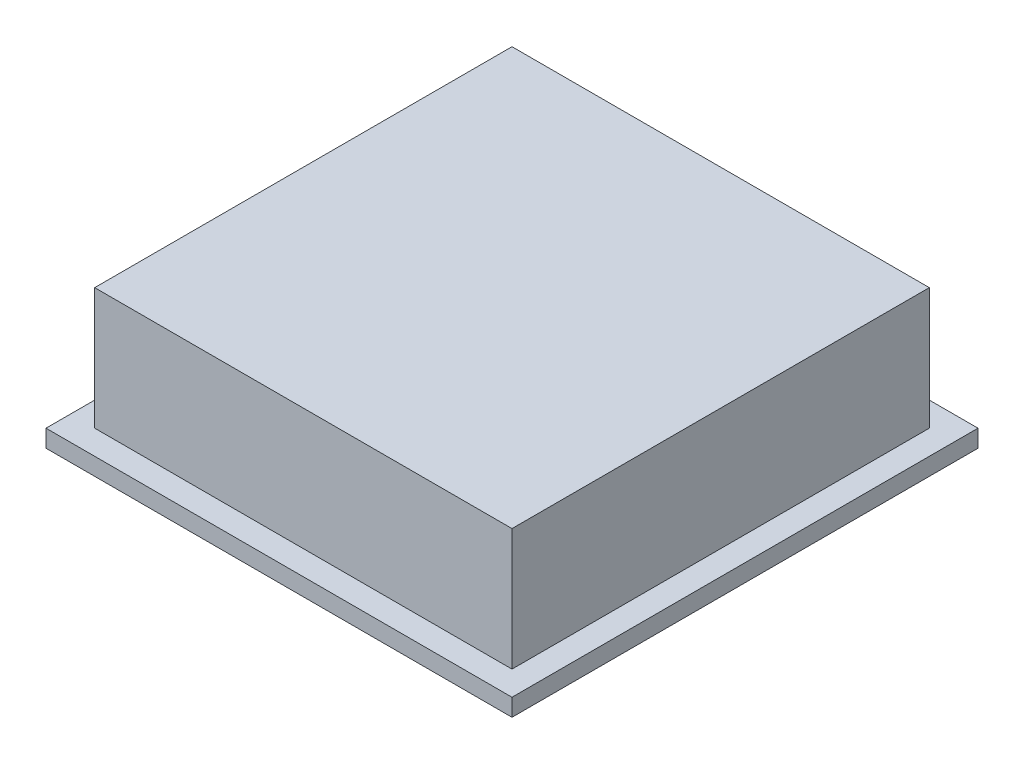
ISO-10303-21;
HEADER;
FILE_DESCRIPTION(('STEP AP214'),'2;1');
FILE_NAME('part.step','',(''),(''),'','','');
FILE_SCHEMA(('AUTOMOTIVE_DESIGN { 1 0 10303 214 1 1 1 1 }'));
ENDSEC;
DATA;
#1=APPLICATION_CONTEXT('core data for automotive mechanical design processes');
#2=APPLICATION_PROTOCOL_DEFINITION('international standard','automotive_design',2000,#1);
#3=PRODUCT_CONTEXT('',#1,'mechanical');
#4=PRODUCT('Part','Part','',(#3));
#5=PRODUCT_RELATED_PRODUCT_CATEGORY('part','',(#4));
#6=PRODUCT_DEFINITION_FORMATION('','',#4);
#7=PRODUCT_DEFINITION_CONTEXT('part definition',#1,'design');
#8=PRODUCT_DEFINITION('design','',#6,#7);
#9=PRODUCT_DEFINITION_SHAPE('','',#8);
#10=(LENGTH_UNIT() NAMED_UNIT(*) SI_UNIT(.MILLI.,.METRE.));
#11=(NAMED_UNIT(*) PLANE_ANGLE_UNIT() SI_UNIT($,.RADIAN.));
#12=(NAMED_UNIT(*) SI_UNIT($,.STERADIAN.) SOLID_ANGLE_UNIT());
#13=UNCERTAINTY_MEASURE_WITH_UNIT(LENGTH_MEASURE(1.E-05),#10,'distance_accuracy_value','');
#14=(GEOMETRIC_REPRESENTATION_CONTEXT(3) GLOBAL_UNCERTAINTY_ASSIGNED_CONTEXT((#13)) GLOBAL_UNIT_ASSIGNED_CONTEXT((#10,
#11,#12)) REPRESENTATION_CONTEXT('',''));
#15=CARTESIAN_POINT('',(0.,0.,0.));
#16=DIRECTION('',(0.,0.,1.));
#17=DIRECTION('',(1.,0.,0.));
#18=AXIS2_PLACEMENT_3D('',#15,#16,#17);
#19=CARTESIAN_POINT('',(0.,0.5,0.));
#20=DIRECTION('',(0.,-1.,0.));
#21=DIRECTION('',(0.,0.,-1.));
#22=AXIS2_PLACEMENT_3D('',#19,#20,#21);
#23=PLANE('',#22);
#24=DIRECTION('',(0.,0.,-1.));
#25=VECTOR('',#24,1.);
#26=CARTESIAN_POINT('',(6.7,0.5,6.7));
#27=LINE('',#26,#25);
#28=CARTESIAN_POINT('',(6.7,0.5,6.7));
#29=VERTEX_POINT('',#28);
#30=CARTESIAN_POINT('',(6.7,0.5,-6.7));
#31=VERTEX_POINT('',#30);
#32=EDGE_CURVE('E130',#29,#31,#27,.T.);
#33=ORIENTED_EDGE('',*,*,#32,.T.);
#34=DIRECTION('',(-1.,0.,0.));
#35=VECTOR('',#34,1.);
#36=CARTESIAN_POINT('',(-6.7,0.5,-6.7));
#37=LINE('',#36,#35);
#38=CARTESIAN_POINT('',(-6.7,0.5,-6.7));
#39=VERTEX_POINT('',#38);
#40=EDGE_CURVE('E133',#31,#39,#37,.T.);
#41=ORIENTED_EDGE('',*,*,#40,.T.);
#42=DIRECTION('',(0.,0.,1.));
#43=VECTOR('',#42,1.);
#44=CARTESIAN_POINT('',(-6.7,0.5,6.7));
#45=LINE('',#44,#43);
#46=CARTESIAN_POINT('',(-6.7,0.5,6.7));
#47=VERTEX_POINT('',#46);
#48=EDGE_CURVE('E136',#39,#47,#45,.T.);
#49=ORIENTED_EDGE('',*,*,#48,.T.);
#50=DIRECTION('',(1.,0.,0.));
#51=VECTOR('',#50,1.);
#52=CARTESIAN_POINT('',(-6.7,0.5,6.7));
#53=LINE('',#52,#51);
#54=EDGE_CURVE('E138',#47,#29,#53,.T.);
#55=ORIENTED_EDGE('',*,*,#54,.T.);
#56=EDGE_LOOP('',(#33,#41,#49,#55));
#57=FACE_BOUND('',#56,.T.);
#58=DIRECTION('',(0.,0.,-1.));
#59=VECTOR('',#58,1.);
#60=CARTESIAN_POINT('',(6.,0.5,0.));
#61=LINE('',#60,#59);
#62=CARTESIAN_POINT('',(6.,0.5,6.));
#63=VERTEX_POINT('',#62);
#64=CARTESIAN_POINT('',(6.,0.5,-6.));
#65=VERTEX_POINT('',#64);
#66=EDGE_CURVE('E117',#63,#65,#61,.T.);
#67=ORIENTED_EDGE('',*,*,#66,.F.);
#68=DIRECTION('',(1.,0.,0.));
#69=VECTOR('',#68,1.);
#70=CARTESIAN_POINT('',(0.,0.5,6.));
#71=LINE('',#70,#69);
#72=CARTESIAN_POINT('',(-6.,0.5,6.));
#73=VERTEX_POINT('',#72);
#74=EDGE_CURVE('E118',#73,#63,#71,.T.);
#75=ORIENTED_EDGE('',*,*,#74,.F.);
#76=DIRECTION('',(0.,0.,1.));
#77=VECTOR('',#76,1.);
#78=CARTESIAN_POINT('',(-6.,0.5,0.));
#79=LINE('',#78,#77);
#80=CARTESIAN_POINT('',(-6.,0.5,-6.));
#81=VERTEX_POINT('',#80);
#82=EDGE_CURVE('E53',#81,#73,#79,.T.);
#83=ORIENTED_EDGE('',*,*,#82,.F.);
#84=DIRECTION('',(-1.,0.,0.));
#85=VECTOR('',#84,1.);
#86=CARTESIAN_POINT('',(0.,0.5,-6.));
#87=LINE('',#86,#85);
#88=EDGE_CURVE('E48',#65,#81,#87,.T.);
#89=ORIENTED_EDGE('',*,*,#88,.F.);
#90=EDGE_LOOP('',(#67,#75,#83,#89));
#91=FACE_BOUND('',#90,.T.);
#92=ADVANCED_FACE('F33',(#57,#91),#23,.F.);
#93=CARTESIAN_POINT('',(6.7,0.5,6.7));
#94=DIRECTION('',(-1.,0.,0.));
#95=DIRECTION('',(0.,0.,1.));
#96=AXIS2_PLACEMENT_3D('',#93,#94,#95);
#97=PLANE('',#96);
#98=DIRECTION('',(0.,0.,-1.));
#99=VECTOR('',#98,1.);
#100=CARTESIAN_POINT('',(6.7,0.,6.7));
#101=LINE('',#100,#99);
#102=CARTESIAN_POINT('',(6.7,0.,6.7));
#103=VERTEX_POINT('',#102);
#104=CARTESIAN_POINT('',(6.7,0.,-6.7));
#105=VERTEX_POINT('',#104);
#106=EDGE_CURVE('E129',#103,#105,#101,.T.);
#107=ORIENTED_EDGE('',*,*,#106,.T.);
#108=DIRECTION('',(0.,-1.,0.));
#109=VECTOR('',#108,1.);
#110=CARTESIAN_POINT('',(6.7,0.5,-6.7));
#111=LINE('',#110,#109);
#112=EDGE_CURVE('E11',#31,#105,#111,.T.);
#113=ORIENTED_EDGE('',*,*,#112,.F.);
#114=ORIENTED_EDGE('',*,*,#32,.F.);
#115=DIRECTION('',(0.,-1.,0.));
#116=VECTOR('',#115,1.);
#117=CARTESIAN_POINT('',(6.7,0.5,6.7));
#118=LINE('',#117,#116);
#119=EDGE_CURVE('E140',#29,#103,#118,.T.);
#120=ORIENTED_EDGE('',*,*,#119,.T.);
#121=EDGE_LOOP('',(#107,#113,#114,#120));
#122=FACE_BOUND('',#121,.T.);
#123=ADVANCED_FACE('F35',(#122),#97,.F.);
#124=CARTESIAN_POINT('',(-6.7,0.5,-6.7));
#125=DIRECTION('',(0.,0.,1.));
#126=DIRECTION('',(1.,0.,0.));
#127=AXIS2_PLACEMENT_3D('',#124,#125,#126);
#128=PLANE('',#127);
#129=DIRECTION('',(-1.,0.,0.));
#130=VECTOR('',#129,1.);
#131=CARTESIAN_POINT('',(-6.7,0.,-6.7));
#132=LINE('',#131,#130);
#133=CARTESIAN_POINT('',(-6.7,0.,-6.7));
#134=VERTEX_POINT('',#133);
#135=EDGE_CURVE('E143',#105,#134,#132,.T.);
#136=ORIENTED_EDGE('',*,*,#135,.T.);
#137=DIRECTION('',(0.,-1.,0.));
#138=VECTOR('',#137,1.);
#139=CARTESIAN_POINT('',(-6.7,0.5,-6.7));
#140=LINE('',#139,#138);
#141=EDGE_CURVE('E41',#39,#134,#140,.T.);
#142=ORIENTED_EDGE('',*,*,#141,.F.);
#143=ORIENTED_EDGE('',*,*,#40,.F.);
#144=ORIENTED_EDGE('',*,*,#112,.T.);
#145=EDGE_LOOP('',(#136,#142,#143,#144));
#146=FACE_BOUND('',#145,.T.);
#147=ADVANCED_FACE('F172',(#146),#128,.F.);
#148=CARTESIAN_POINT('',(-6.7,0.5,6.7));
#149=DIRECTION('',(1.,0.,0.));
#150=DIRECTION('',(0.,0.,-1.));
#151=AXIS2_PLACEMENT_3D('',#148,#149,#150);
#152=PLANE('',#151);
#153=DIRECTION('',(0.,0.,1.));
#154=VECTOR('',#153,1.);
#155=CARTESIAN_POINT('',(-6.7,0.,6.7));
#156=LINE('',#155,#154);
#157=CARTESIAN_POINT('',(-6.7,0.,6.7));
#158=VERTEX_POINT('',#157);
#159=EDGE_CURVE('E145',#134,#158,#156,.T.);
#160=ORIENTED_EDGE('',*,*,#159,.T.);
#161=DIRECTION('',(0.,-1.,0.));
#162=VECTOR('',#161,1.);
#163=CARTESIAN_POINT('',(-6.7,0.5,6.7));
#164=LINE('',#163,#162);
#165=EDGE_CURVE('E150',#47,#158,#164,.T.);
#166=ORIENTED_EDGE('',*,*,#165,.F.);
#167=ORIENTED_EDGE('',*,*,#48,.F.);
#168=ORIENTED_EDGE('',*,*,#141,.T.);
#169=EDGE_LOOP('',(#160,#166,#167,#168));
#170=FACE_BOUND('',#169,.T.);
#171=ADVANCED_FACE('F157',(#170),#152,.F.);
#172=CARTESIAN_POINT('',(-6.7,0.5,6.7));
#173=DIRECTION('',(0.,0.,-1.));
#174=DIRECTION('',(-1.,0.,0.));
#175=AXIS2_PLACEMENT_3D('',#172,#173,#174);
#176=PLANE('',#175);
#177=DIRECTION('',(1.,0.,0.));
#178=VECTOR('',#177,1.);
#179=CARTESIAN_POINT('',(-6.7,0.,6.7));
#180=LINE('',#179,#178);
#181=EDGE_CURVE('E134',#158,#103,#180,.T.);
#182=ORIENTED_EDGE('',*,*,#181,.T.);
#183=ORIENTED_EDGE('',*,*,#119,.F.);
#184=ORIENTED_EDGE('',*,*,#54,.F.);
#185=ORIENTED_EDGE('',*,*,#165,.T.);
#186=EDGE_LOOP('',(#182,#183,#184,#185));
#187=FACE_BOUND('',#186,.T.);
#188=ADVANCED_FACE('F166',(#187),#176,.F.);
#189=CARTESIAN_POINT('',(0.,0.,0.));
#190=DIRECTION('',(0.,-1.,0.));
#191=DIRECTION('',(0.,0.,-1.));
#192=AXIS2_PLACEMENT_3D('',#189,#190,#191);
#193=PLANE('',#192);
#194=ORIENTED_EDGE('',*,*,#106,.F.);
#195=ORIENTED_EDGE('',*,*,#181,.F.);
#196=ORIENTED_EDGE('',*,*,#159,.F.);
#197=ORIENTED_EDGE('',*,*,#135,.F.);
#198=EDGE_LOOP('',(#194,#195,#196,#197));
#199=FACE_BOUND('',#198,.T.);
#200=ADVANCED_FACE('F163',(#199),#193,.T.);
#201=CARTESIAN_POINT('',(6.,4.,6.));
#202=DIRECTION('',(-1.,0.,0.));
#203=DIRECTION('',(0.,0.,1.));
#204=AXIS2_PLACEMENT_3D('',#201,#202,#203);
#205=PLANE('',#204);
#206=DIRECTION('',(0.,-1.,0.));
#207=VECTOR('',#206,1.);
#208=CARTESIAN_POINT('',(6.,4.,6.));
#209=LINE('',#208,#207);
#210=CARTESIAN_POINT('',(6.,4.,6.));
#211=VERTEX_POINT('',#210);
#212=EDGE_CURVE('E265',#211,#63,#209,.T.);
#213=ORIENTED_EDGE('',*,*,#212,.T.);
#214=ORIENTED_EDGE('',*,*,#66,.T.);
#215=DIRECTION('',(0.,-1.,0.));
#216=VECTOR('',#215,1.);
#217=CARTESIAN_POINT('',(6.,4.,-6.));
#218=LINE('',#217,#216);
#219=CARTESIAN_POINT('',(6.,4.,-6.));
#220=VERTEX_POINT('',#219);
#221=EDGE_CURVE('E100',#220,#65,#218,.T.);
#222=ORIENTED_EDGE('',*,*,#221,.F.);
#223=DIRECTION('',(0.,0.,-1.));
#224=VECTOR('',#223,1.);
#225=CARTESIAN_POINT('',(6.,4.,6.));
#226=LINE('',#225,#224);
#227=EDGE_CURVE('E106',#211,#220,#226,.T.);
#228=ORIENTED_EDGE('',*,*,#227,.F.);
#229=EDGE_LOOP('',(#213,#214,#222,#228));
#230=FACE_BOUND('',#229,.T.);
#231=ADVANCED_FACE('F116',(#230),#205,.F.);
#232=CARTESIAN_POINT('',(-6.,4.,-6.));
#233=DIRECTION('',(0.,0.,1.));
#234=DIRECTION('',(1.,0.,0.));
#235=AXIS2_PLACEMENT_3D('',#232,#233,#234);
#236=PLANE('',#235);
#237=ORIENTED_EDGE('',*,*,#221,.T.);
#238=ORIENTED_EDGE('',*,*,#88,.T.);
#239=DIRECTION('',(0.,-1.,0.));
#240=VECTOR('',#239,1.);
#241=CARTESIAN_POINT('',(-6.,4.,-6.));
#242=LINE('',#241,#240);
#243=CARTESIAN_POINT('',(-6.,4.,-6.));
#244=VERTEX_POINT('',#243);
#245=EDGE_CURVE('E102',#244,#81,#242,.T.);
#246=ORIENTED_EDGE('',*,*,#245,.F.);
#247=DIRECTION('',(-1.,0.,0.));
#248=VECTOR('',#247,1.);
#249=CARTESIAN_POINT('',(-6.,4.,-6.));
#250=LINE('',#249,#248);
#251=EDGE_CURVE('E96',#220,#244,#250,.T.);
#252=ORIENTED_EDGE('',*,*,#251,.F.);
#253=EDGE_LOOP('',(#237,#238,#246,#252));
#254=FACE_BOUND('',#253,.T.);
#255=ADVANCED_FACE('F98',(#254),#236,.F.);
#256=CARTESIAN_POINT('',(-6.,4.,6.));
#257=DIRECTION('',(1.,0.,0.));
#258=DIRECTION('',(0.,0.,-1.));
#259=AXIS2_PLACEMENT_3D('',#256,#257,#258);
#260=PLANE('',#259);
#261=ORIENTED_EDGE('',*,*,#245,.T.);
#262=ORIENTED_EDGE('',*,*,#82,.T.);
#263=DIRECTION('',(0.,-1.,0.));
#264=VECTOR('',#263,1.);
#265=CARTESIAN_POINT('',(-6.,4.,6.));
#266=LINE('',#265,#264);
#267=CARTESIAN_POINT('',(-6.,4.,6.));
#268=VERTEX_POINT('',#267);
#269=EDGE_CURVE('E122',#268,#73,#266,.T.);
#270=ORIENTED_EDGE('',*,*,#269,.F.);
#271=DIRECTION('',(0.,0.,1.));
#272=VECTOR('',#271,1.);
#273=CARTESIAN_POINT('',(-6.,4.,6.));
#274=LINE('',#273,#272);
#275=EDGE_CURVE('E105',#244,#268,#274,.T.);
#276=ORIENTED_EDGE('',*,*,#275,.F.);
#277=EDGE_LOOP('',(#261,#262,#270,#276));
#278=FACE_BOUND('',#277,.T.);
#279=ADVANCED_FACE('F208',(#278),#260,.F.);
#280=CARTESIAN_POINT('',(-6.,4.,6.));
#281=DIRECTION('',(0.,0.,-1.));
#282=DIRECTION('',(-1.,0.,0.));
#283=AXIS2_PLACEMENT_3D('',#280,#281,#282);
#284=PLANE('',#283);
#285=ORIENTED_EDGE('',*,*,#269,.T.);
#286=ORIENTED_EDGE('',*,*,#74,.T.);
#287=ORIENTED_EDGE('',*,*,#212,.F.);
#288=DIRECTION('',(1.,0.,0.));
#289=VECTOR('',#288,1.);
#290=CARTESIAN_POINT('',(-6.,4.,6.));
#291=LINE('',#290,#289);
#292=EDGE_CURVE('E111',#268,#211,#291,.T.);
#293=ORIENTED_EDGE('',*,*,#292,.F.);
#294=EDGE_LOOP('',(#285,#286,#287,#293));
#295=FACE_BOUND('',#294,.T.);
#296=ADVANCED_FACE('F214',(#295),#284,.F.);
#297=CARTESIAN_POINT('',(0.,4.,0.));
#298=DIRECTION('',(0.,-1.,0.));
#299=DIRECTION('',(0.,0.,-1.));
#300=AXIS2_PLACEMENT_3D('',#297,#298,#299);
#301=PLANE('',#300);
#302=ORIENTED_EDGE('',*,*,#227,.T.);
#303=ORIENTED_EDGE('',*,*,#251,.T.);
#304=ORIENTED_EDGE('',*,*,#275,.T.);
#305=ORIENTED_EDGE('',*,*,#292,.T.);
#306=EDGE_LOOP('',(#302,#303,#304,#305));
#307=FACE_BOUND('',#306,.T.);
#308=ADVANCED_FACE('F109',(#307),#301,.F.);
#309=CLOSED_SHELL('',(#92,#123,#147,#171,#188,#200,#231,#255,#279,#296,#308));
#310=MANIFOLD_SOLID_BREP('B2',#309);
#311=ADVANCED_BREP_SHAPE_REPRESENTATION('',(#18,#310),#14);
#312=SHAPE_DEFINITION_REPRESENTATION(#9,#311);
ENDSEC;
END-ISO-10303-21;
